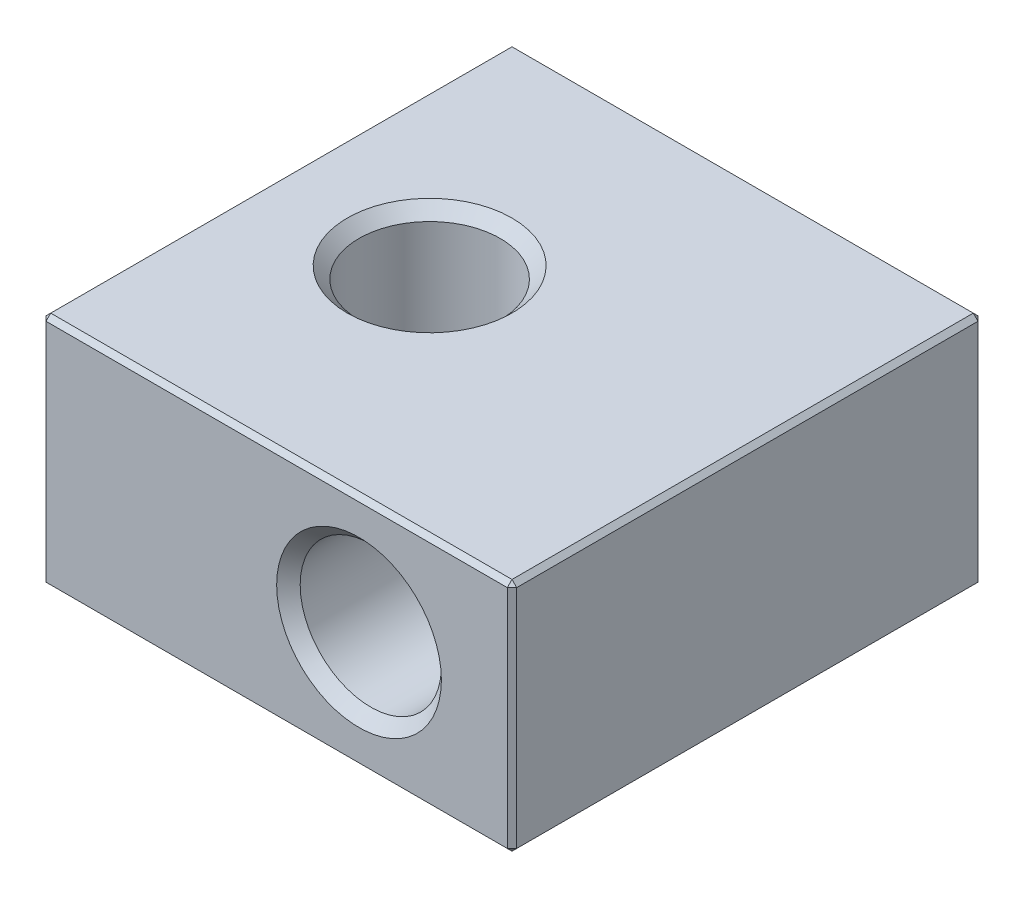
ISO-10303-21;
HEADER;
FILE_DESCRIPTION(('STEP AP214'),'2;1');
FILE_NAME('part.step','',(''),(''),'','','');
FILE_SCHEMA(('AUTOMOTIVE_DESIGN { 1 0 10303 214 1 1 1 1 }'));
ENDSEC;
DATA;
#1=APPLICATION_CONTEXT('core data for automotive mechanical design processes');
#2=APPLICATION_PROTOCOL_DEFINITION('international standard','automotive_design',2000,#1);
#3=PRODUCT_CONTEXT('',#1,'mechanical');
#4=PRODUCT('Part','Part','',(#3));
#5=PRODUCT_RELATED_PRODUCT_CATEGORY('part','',(#4));
#6=PRODUCT_DEFINITION_FORMATION('','',#4);
#7=PRODUCT_DEFINITION_CONTEXT('part definition',#1,'design');
#8=PRODUCT_DEFINITION('design','',#6,#7);
#9=PRODUCT_DEFINITION_SHAPE('','',#8);
#10=(LENGTH_UNIT() NAMED_UNIT(*) SI_UNIT(.MILLI.,.METRE.));
#11=(NAMED_UNIT(*) PLANE_ANGLE_UNIT() SI_UNIT($,.RADIAN.));
#12=(NAMED_UNIT(*) SI_UNIT($,.STERADIAN.) SOLID_ANGLE_UNIT());
#13=UNCERTAINTY_MEASURE_WITH_UNIT(LENGTH_MEASURE(1.E-05),#10,'distance_accuracy_value','');
#14=(GEOMETRIC_REPRESENTATION_CONTEXT(3) GLOBAL_UNCERTAINTY_ASSIGNED_CONTEXT((#13)) GLOBAL_UNIT_ASSIGNED_CONTEXT((#10,
#11,#12)) REPRESENTATION_CONTEXT('',''));
#15=CARTESIAN_POINT('',(0.,0.,0.));
#16=DIRECTION('',(0.,0.,1.));
#17=DIRECTION('',(1.,0.,0.));
#18=AXIS2_PLACEMENT_3D('',#15,#16,#17);
#19=CARTESIAN_POINT('',(0.,10.,0.));
#20=DIRECTION('',(0.,1.,0.));
#21=DIRECTION('',(0.,0.,1.));
#22=AXIS2_PLACEMENT_3D('',#19,#20,#21);
#23=PLANE('',#22);
#24=DIRECTION('',(1.,0.,0.));
#25=VECTOR('',#24,1.);
#26=CARTESIAN_POINT('',(18.9320388349514,10.,12.9553398058252));
#27=LINE('',#26,#25);
#28=CARTESIAN_POINT('',(-0.867961165048559,10.,12.9553398058252));
#29=VERTEX_POINT('',#28);
#30=CARTESIAN_POINT('',(18.7320388349514,10.,12.9553398058252));
#31=VERTEX_POINT('',#30);
#32=EDGE_CURVE('E138',#29,#31,#27,.T.);
#33=ORIENTED_EDGE('',*,*,#32,.T.);
#34=DIRECTION('',(0.,0.,-1.));
#35=VECTOR('',#34,1.);
#36=CARTESIAN_POINT('',(18.7320388349514,10.,-6.84466019417476));
#37=LINE('',#36,#35);
#38=CARTESIAN_POINT('',(18.7320388349514,10.,-6.64466019417476));
#39=VERTEX_POINT('',#38);
#40=EDGE_CURVE('E182',#31,#39,#37,.T.);
#41=ORIENTED_EDGE('',*,*,#40,.T.);
#42=DIRECTION('',(-1.,0.,0.));
#43=VECTOR('',#42,1.);
#44=CARTESIAN_POINT('',(-1.06796116504856,10.,-6.64466019417476));
#45=LINE('',#44,#43);
#46=CARTESIAN_POINT('',(-0.86796116504856,10.,-6.64466019417476));
#47=VERTEX_POINT('',#46);
#48=EDGE_CURVE('E141',#39,#47,#45,.T.);
#49=ORIENTED_EDGE('',*,*,#48,.T.);
#50=DIRECTION('',(0.,0.,1.));
#51=VECTOR('',#50,1.);
#52=CARTESIAN_POINT('',(-0.867961165048559,10.,13.1553398058252));
#53=LINE('',#52,#51);
#54=EDGE_CURVE('E133',#47,#29,#53,.T.);
#55=ORIENTED_EDGE('',*,*,#54,.T.);
#56=EDGE_LOOP('',(#33,#41,#49,#55));
#57=FACE_BOUND('',#56,.T.);
#58=CARTESIAN_POINT('',(5.43203883495144,10.,3.15533980582524));
#59=DIRECTION('',(0.,1.,0.));
#60=DIRECTION('',(0.,0.,1.));
#61=AXIS2_PLACEMENT_3D('',#58,#59,#60);
#62=CIRCLE('',#61,3.50000000000001);
#63=CARTESIAN_POINT('',(5.43203883495144,10.,6.65533980582525));
#64=VERTEX_POINT('',#63);
#65=EDGE_CURVE('E345',#64,#64,#62,.F.);
#66=ORIENTED_EDGE('',*,*,#65,.T.);
#67=EDGE_LOOP('',(#66));
#68=FACE_BOUND('',#67,.T.);
#69=ADVANCED_FACE('F41',(#57,#68),#23,.T.);
#70=CARTESIAN_POINT('',(0.,0.,0.));
#71=DIRECTION('',(0.,1.,0.));
#72=DIRECTION('',(0.,0.,1.));
#73=AXIS2_PLACEMENT_3D('',#70,#71,#72);
#74=PLANE('',#73);
#75=DIRECTION('',(0.,0.,1.));
#76=VECTOR('',#75,1.);
#77=CARTESIAN_POINT('',(18.7320388349514,0.,0.));
#78=LINE('',#77,#76);
#79=CARTESIAN_POINT('',(18.7320388349514,0.,-6.64466019417476));
#80=VERTEX_POINT('',#79);
#81=CARTESIAN_POINT('',(18.7320388349514,0.,12.9553398058252));
#82=VERTEX_POINT('',#81);
#83=EDGE_CURVE('E217',#80,#82,#78,.T.);
#84=ORIENTED_EDGE('',*,*,#83,.T.);
#85=DIRECTION('',(-1.,0.,0.));
#86=VECTOR('',#85,1.);
#87=CARTESIAN_POINT('',(0.,0.,12.9553398058252));
#88=LINE('',#87,#86);
#89=CARTESIAN_POINT('',(-0.867961165048559,0.,12.9553398058252));
#90=VERTEX_POINT('',#89);
#91=EDGE_CURVE('E220',#82,#90,#88,.T.);
#92=ORIENTED_EDGE('',*,*,#91,.T.);
#93=DIRECTION('',(0.,0.,-1.));
#94=VECTOR('',#93,1.);
#95=CARTESIAN_POINT('',(-0.86796116504856,0.,0.));
#96=LINE('',#95,#94);
#97=CARTESIAN_POINT('',(-0.86796116504856,0.,-6.64466019417476));
#98=VERTEX_POINT('',#97);
#99=EDGE_CURVE('E211',#90,#98,#96,.T.);
#100=ORIENTED_EDGE('',*,*,#99,.T.);
#101=DIRECTION('',(1.,0.,0.));
#102=VECTOR('',#101,1.);
#103=CARTESIAN_POINT('',(0.,0.,-6.64466019417476));
#104=LINE('',#103,#102);
#105=EDGE_CURVE('E214',#98,#80,#104,.T.);
#106=ORIENTED_EDGE('',*,*,#105,.T.);
#107=EDGE_LOOP('',(#84,#92,#100,#106));
#108=FACE_BOUND('',#107,.T.);
#109=CARTESIAN_POINT('',(5.43203883495144,0.,3.15533980582524));
#110=DIRECTION('',(0.,1.,0.));
#111=DIRECTION('',(0.,0.,1.));
#112=AXIS2_PLACEMENT_3D('',#109,#110,#111);
#113=CIRCLE('',#112,3.5);
#114=CARTESIAN_POINT('',(5.43203883495144,0.,6.65533980582525));
#115=VERTEX_POINT('',#114);
#116=EDGE_CURVE('E176',#115,#115,#113,.T.);
#117=ORIENTED_EDGE('',*,*,#116,.T.);
#118=EDGE_LOOP('',(#117));
#119=FACE_BOUND('',#118,.T.);
#120=ADVANCED_FACE('F352',(#108,#119),#74,.F.);
#121=CARTESIAN_POINT('',(-1.06796116504856,10.,-6.84466019417476));
#122=DIRECTION('',(1.,0.,0.));
#123=DIRECTION('',(0.,0.,-1.));
#124=AXIS2_PLACEMENT_3D('',#121,#122,#123);
#125=PLANE('',#124);
#126=DIRECTION('',(0.,0.,-1.));
#127=VECTOR('',#126,1.);
#128=CARTESIAN_POINT('',(-1.06796116504856,9.8,-6.84466019417476));
#129=LINE('',#128,#127);
#130=CARTESIAN_POINT('',(-1.06796116504856,9.8,12.9553398058252));
#131=VERTEX_POINT('',#130);
#132=CARTESIAN_POINT('',(-1.06796116504856,9.8,-6.64466019417476));
#133=VERTEX_POINT('',#132);
#134=EDGE_CURVE('E66',#131,#133,#129,.T.);
#135=ORIENTED_EDGE('',*,*,#134,.T.);
#136=DIRECTION('',(0.,-1.,0.));
#137=VECTOR('',#136,1.);
#138=CARTESIAN_POINT('',(-1.06796116504856,10.,-6.64466019417476));
#139=LINE('',#138,#137);
#140=CARTESIAN_POINT('',(-1.06796116504856,0.199999999999999,-6.64466019417476));
#141=VERTEX_POINT('',#140);
#142=EDGE_CURVE('E11',#133,#141,#139,.T.);
#143=ORIENTED_EDGE('',*,*,#142,.T.);
#144=DIRECTION('',(0.,0.,1.));
#145=VECTOR('',#144,1.);
#146=CARTESIAN_POINT('',(-1.06796116504856,0.199999999999999,-6.84466019417476));
#147=LINE('',#146,#145);
#148=CARTESIAN_POINT('',(-1.06796116504856,0.199999999999999,12.9553398058252));
#149=VERTEX_POINT('',#148);
#150=EDGE_CURVE('E51',#141,#149,#147,.T.);
#151=ORIENTED_EDGE('',*,*,#150,.T.);
#152=DIRECTION('',(0.,1.,0.));
#153=VECTOR('',#152,1.);
#154=CARTESIAN_POINT('',(-1.06796116504856,10.,12.9553398058252));
#155=LINE('',#154,#153);
#156=EDGE_CURVE('E237',#149,#131,#155,.T.);
#157=ORIENTED_EDGE('',*,*,#156,.T.);
#158=EDGE_LOOP('',(#135,#143,#151,#157));
#159=FACE_BOUND('',#158,.T.);
#160=ADVANCED_FACE('F375',(#159),#125,.F.);
#161=CARTESIAN_POINT('',(-1.06796116504856,10.,13.1553398058252));
#162=DIRECTION('',(0.,0.,-1.));
#163=DIRECTION('',(-1.,0.,0.));
#164=AXIS2_PLACEMENT_3D('',#161,#162,#163);
#165=PLANE('',#164);
#166=DIRECTION('',(0.,-1.,0.));
#167=VECTOR('',#166,1.);
#168=CARTESIAN_POINT('',(-0.867961165048559,10.,13.1553398058252));
#169=LINE('',#168,#167);
#170=CARTESIAN_POINT('',(-0.867961165048559,9.8,13.1553398058252));
#171=VERTEX_POINT('',#170);
#172=CARTESIAN_POINT('',(-0.867961165048559,0.199999999999999,13.1553398058252));
#173=VERTEX_POINT('',#172);
#174=EDGE_CURVE('E198',#171,#173,#169,.T.);
#175=ORIENTED_EDGE('',*,*,#174,.T.);
#176=DIRECTION('',(1.,0.,0.));
#177=VECTOR('',#176,1.);
#178=CARTESIAN_POINT('',(-1.06796116504856,0.199999999999999,13.1553398058252));
#179=LINE('',#178,#177);
#180=CARTESIAN_POINT('',(18.7320388349514,0.199999999999999,13.1553398058252));
#181=VERTEX_POINT('',#180);
#182=EDGE_CURVE('E207',#173,#181,#179,.T.);
#183=ORIENTED_EDGE('',*,*,#182,.T.);
#184=DIRECTION('',(0.,1.,0.));
#185=VECTOR('',#184,1.);
#186=CARTESIAN_POINT('',(18.7320388349514,10.,13.1553398058252));
#187=LINE('',#186,#185);
#188=CARTESIAN_POINT('',(18.7320388349514,9.8,13.1553398058252));
#189=VERTEX_POINT('',#188);
#190=EDGE_CURVE('E204',#181,#189,#187,.T.);
#191=ORIENTED_EDGE('',*,*,#190,.T.);
#192=DIRECTION('',(-1.,0.,0.));
#193=VECTOR('',#192,1.);
#194=CARTESIAN_POINT('',(-1.06796116504856,9.8,13.1553398058252));
#195=LINE('',#194,#193);
#196=EDGE_CURVE('E201',#189,#171,#195,.T.);
#197=ORIENTED_EDGE('',*,*,#196,.T.);
#198=EDGE_LOOP('',(#175,#183,#191,#197));
#199=FACE_BOUND('',#198,.T.);
#200=CARTESIAN_POINT('',(12.4320388349514,5.,13.1553398058252));
#201=DIRECTION('',(0.,0.,-1.));
#202=DIRECTION('',(-1.,0.,0.));
#203=AXIS2_PLACEMENT_3D('',#200,#201,#202);
#204=CIRCLE('',#203,3.5);
#205=CARTESIAN_POINT('',(8.93203883495145,5.,13.1553398058252));
#206=VERTEX_POINT('',#205);
#207=EDGE_CURVE('E172',#206,#206,#204,.T.);
#208=ORIENTED_EDGE('',*,*,#207,.T.);
#209=EDGE_LOOP('',(#208));
#210=FACE_BOUND('',#209,.T.);
#211=ADVANCED_FACE('F389',(#199,#210),#165,.F.);
#212=CARTESIAN_POINT('',(18.9320388349514,10.,-6.84466019417476));
#213=DIRECTION('',(-1.,0.,0.));
#214=DIRECTION('',(0.,0.,1.));
#215=AXIS2_PLACEMENT_3D('',#212,#213,#214);
#216=PLANE('',#215);
#217=DIRECTION('',(0.,1.,0.));
#218=VECTOR('',#217,1.);
#219=CARTESIAN_POINT('',(18.9320388349514,10.,-6.64466019417476));
#220=LINE('',#219,#218);
#221=CARTESIAN_POINT('',(18.9320388349514,0.199999999999999,-6.64466019417476));
#222=VERTEX_POINT('',#221);
#223=CARTESIAN_POINT('',(18.9320388349514,9.8,-6.64466019417476));
#224=VERTEX_POINT('',#223);
#225=EDGE_CURVE('E185',#222,#224,#220,.T.);
#226=ORIENTED_EDGE('',*,*,#225,.T.);
#227=DIRECTION('',(0.,0.,1.));
#228=VECTOR('',#227,1.);
#229=CARTESIAN_POINT('',(18.9320388349514,9.8,13.1553398058252));
#230=LINE('',#229,#228);
#231=CARTESIAN_POINT('',(18.9320388349514,9.8,12.9553398058252));
#232=VERTEX_POINT('',#231);
#233=EDGE_CURVE('E194',#224,#232,#230,.T.);
#234=ORIENTED_EDGE('',*,*,#233,.T.);
#235=DIRECTION('',(0.,-1.,0.));
#236=VECTOR('',#235,1.);
#237=CARTESIAN_POINT('',(18.9320388349514,10.,12.9553398058252));
#238=LINE('',#237,#236);
#239=CARTESIAN_POINT('',(18.9320388349514,0.199999999999999,12.9553398058252));
#240=VERTEX_POINT('',#239);
#241=EDGE_CURVE('E191',#232,#240,#238,.T.);
#242=ORIENTED_EDGE('',*,*,#241,.T.);
#243=DIRECTION('',(0.,0.,-1.));
#244=VECTOR('',#243,1.);
#245=CARTESIAN_POINT('',(18.9320388349514,0.199999999999999,-6.84466019417476));
#246=LINE('',#245,#244);
#247=EDGE_CURVE('E188',#240,#222,#246,.T.);
#248=ORIENTED_EDGE('',*,*,#247,.T.);
#249=EDGE_LOOP('',(#226,#234,#242,#248));
#250=FACE_BOUND('',#249,.T.);
#251=ADVANCED_FACE('F385',(#250),#216,.F.);
#252=CARTESIAN_POINT('',(-1.06796116504856,10.,-6.84466019417476));
#253=DIRECTION('',(0.,0.,1.));
#254=DIRECTION('',(1.,0.,0.));
#255=AXIS2_PLACEMENT_3D('',#252,#253,#254);
#256=PLANE('',#255);
#257=DIRECTION('',(1.,0.,0.));
#258=VECTOR('',#257,1.);
#259=CARTESIAN_POINT('',(18.9320388349514,9.8,-6.84466019417476));
#260=LINE('',#259,#258);
#261=CARTESIAN_POINT('',(-0.86796116504856,9.8,-6.84466019417476));
#262=VERTEX_POINT('',#261);
#263=CARTESIAN_POINT('',(18.7320388349514,9.8,-6.84466019417476));
#264=VERTEX_POINT('',#263);
#265=EDGE_CURVE('E230',#262,#264,#260,.T.);
#266=ORIENTED_EDGE('',*,*,#265,.T.);
#267=DIRECTION('',(0.,-1.,0.));
#268=VECTOR('',#267,1.);
#269=CARTESIAN_POINT('',(18.7320388349514,10.,-6.84466019417476));
#270=LINE('',#269,#268);
#271=CARTESIAN_POINT('',(18.7320388349514,0.199999999999999,-6.84466019417476));
#272=VERTEX_POINT('',#271);
#273=EDGE_CURVE('E233',#264,#272,#270,.T.);
#274=ORIENTED_EDGE('',*,*,#273,.T.);
#275=DIRECTION('',(-1.,0.,0.));
#276=VECTOR('',#275,1.);
#277=CARTESIAN_POINT('',(-1.06796116504856,0.199999999999999,-6.84466019417476));
#278=LINE('',#277,#276);
#279=CARTESIAN_POINT('',(-0.86796116504856,0.199999999999999,-6.84466019417476));
#280=VERTEX_POINT('',#279);
#281=EDGE_CURVE('E224',#272,#280,#278,.T.);
#282=ORIENTED_EDGE('',*,*,#281,.T.);
#283=DIRECTION('',(0.,1.,0.));
#284=VECTOR('',#283,1.);
#285=CARTESIAN_POINT('',(-0.86796116504856,10.,-6.84466019417476));
#286=LINE('',#285,#284);
#287=EDGE_CURVE('E227',#280,#262,#286,.T.);
#288=ORIENTED_EDGE('',*,*,#287,.T.);
#289=EDGE_LOOP('',(#266,#274,#282,#288));
#290=FACE_BOUND('',#289,.T.);
#291=CARTESIAN_POINT('',(12.4320388349514,5.,-6.84466019417476));
#292=DIRECTION('',(0.,0.,1.));
#293=DIRECTION('',(1.,0.,0.));
#294=AXIS2_PLACEMENT_3D('',#291,#292,#293);
#295=CIRCLE('',#294,3.5);
#296=CARTESIAN_POINT('',(15.9320388349514,5.,-6.84466019417476));
#297=VERTEX_POINT('',#296);
#298=EDGE_CURVE('E331',#297,#297,#295,.T.);
#299=ORIENTED_EDGE('',*,*,#298,.T.);
#300=EDGE_LOOP('',(#299));
#301=FACE_BOUND('',#300,.T.);
#302=ADVANCED_FACE('F382',(#290,#301),#256,.F.);
#303=CARTESIAN_POINT('',(5.43203883495144,10.,3.15533980582524));
#304=DIRECTION('',(0.,-1.,0.));
#305=DIRECTION('',(0.,0.,-1.));
#306=AXIS2_PLACEMENT_3D('',#303,#304,#305);
#307=CYLINDRICAL_SURFACE('',#306,3.);
#308=CARTESIAN_POINT('',(5.43203883495144,9.5,3.15533980582524));
#309=DIRECTION('',(0.,1.,0.));
#310=DIRECTION('',(0.,0.,1.));
#311=AXIS2_PLACEMENT_3D('',#308,#309,#310);
#312=CIRCLE('',#311,3.);
#313=CARTESIAN_POINT('',(5.43203883495144,9.5,6.15533980582524));
#314=VERTEX_POINT('',#313);
#315=EDGE_CURVE('E341',#314,#314,#312,.T.);
#316=ORIENTED_EDGE('',*,*,#315,.T.);
#317=EDGE_LOOP('',(#316));
#318=FACE_BOUND('',#317,.T.);
#319=CARTESIAN_POINT('',(5.43203883495144,0.500000000000006,3.15533980582524));
#320=DIRECTION('',(0.,1.,0.));
#321=DIRECTION('',(0.,0.,1.));
#322=AXIS2_PLACEMENT_3D('',#319,#320,#321);
#323=CIRCLE('',#322,3.);
#324=CARTESIAN_POINT('',(5.43203883495144,0.500000000000006,6.15533980582524));
#325=VERTEX_POINT('',#324);
#326=EDGE_CURVE('E337',#325,#325,#323,.F.);
#327=ORIENTED_EDGE('',*,*,#326,.T.);
#328=EDGE_LOOP('',(#327));
#329=FACE_BOUND('',#328,.T.);
#330=ADVANCED_FACE('F379',(#318,#329),#307,.F.);
#331=CARTESIAN_POINT('',(12.4320388349514,5.,13.1553398058252));
#332=DIRECTION('',(0.,0.,-1.));
#333=DIRECTION('',(-1.,0.,0.));
#334=AXIS2_PLACEMENT_3D('',#331,#332,#333);
#335=CYLINDRICAL_SURFACE('',#334,3.);
#336=CARTESIAN_POINT('',(12.4320388349514,5.,-6.34466019417476));
#337=DIRECTION('',(0.,0.,1.));
#338=DIRECTION('',(1.,0.,0.));
#339=AXIS2_PLACEMENT_3D('',#336,#337,#338);
#340=CIRCLE('',#339,3.);
#341=CARTESIAN_POINT('',(15.4320388349514,5.,-6.34466019417476));
#342=VERTEX_POINT('',#341);
#343=EDGE_CURVE('E325',#342,#342,#340,.F.);
#344=ORIENTED_EDGE('',*,*,#343,.T.);
#345=EDGE_LOOP('',(#344));
#346=FACE_BOUND('',#345,.T.);
#347=CARTESIAN_POINT('',(12.4320388349514,5.,12.6553398058252));
#348=DIRECTION('',(0.,0.,-1.));
#349=DIRECTION('',(-1.,0.,0.));
#350=AXIS2_PLACEMENT_3D('',#347,#348,#349);
#351=CIRCLE('',#350,3.);
#352=CARTESIAN_POINT('',(9.43203883495144,5.,12.6553398058252));
#353=VERTEX_POINT('',#352);
#354=EDGE_CURVE('E317',#353,#353,#351,.F.);
#355=ORIENTED_EDGE('',*,*,#354,.T.);
#356=EDGE_LOOP('',(#355));
#357=FACE_BOUND('',#356,.T.);
#358=ADVANCED_FACE('F397',(#346,#357),#335,.F.);
#359=CARTESIAN_POINT('',(12.4320388349514,5.,-6.34466019417476));
#360=DIRECTION('',(0.,0.,-1.));
#361=DIRECTION('',(-1.,0.,0.));
#362=AXIS2_PLACEMENT_3D('',#359,#360,#361);
#363=CONICAL_SURFACE('',#362,3.,0.785398163397448);
#364=ORIENTED_EDGE('',*,*,#298,.F.);
#365=EDGE_LOOP('',(#364));
#366=FACE_BOUND('',#365,.T.);
#367=ORIENTED_EDGE('',*,*,#343,.F.);
#368=EDGE_LOOP('',(#367));
#369=FACE_BOUND('',#368,.T.);
#370=ADVANCED_FACE('F366',(#366,#369),#363,.F.);
#371=CARTESIAN_POINT('',(5.43203883495144,9.5,3.15533980582524));
#372=DIRECTION('',(0.,1.,0.));
#373=DIRECTION('',(0.,0.,1.));
#374=AXIS2_PLACEMENT_3D('',#371,#372,#373);
#375=CONICAL_SURFACE('',#374,3.,0.785398163397451);
#376=ORIENTED_EDGE('',*,*,#65,.F.);
#377=EDGE_LOOP('',(#376));
#378=FACE_BOUND('',#377,.T.);
#379=ORIENTED_EDGE('',*,*,#315,.F.);
#380=EDGE_LOOP('',(#379));
#381=FACE_BOUND('',#380,.T.);
#382=ADVANCED_FACE('F357',(#378,#381),#375,.F.);
#383=CARTESIAN_POINT('',(5.43203883495144,0.,3.15533980582524));
#384=DIRECTION('',(0.,-1.,0.));
#385=DIRECTION('',(0.,0.,-1.));
#386=AXIS2_PLACEMENT_3D('',#383,#384,#385);
#387=CONICAL_SURFACE('',#386,3.5,0.785398163397445);
#388=ORIENTED_EDGE('',*,*,#326,.F.);
#389=EDGE_LOOP('',(#388));
#390=FACE_BOUND('',#389,.T.);
#391=ORIENTED_EDGE('',*,*,#116,.F.);
#392=EDGE_LOOP('',(#391));
#393=FACE_BOUND('',#392,.T.);
#394=ADVANCED_FACE('F354',(#390,#393),#387,.F.);
#395=CARTESIAN_POINT('',(12.4320388349514,5.,13.1553398058252));
#396=DIRECTION('',(0.,0.,1.));
#397=DIRECTION('',(1.,0.,0.));
#398=AXIS2_PLACEMENT_3D('',#395,#396,#397);
#399=CONICAL_SURFACE('',#398,3.5,0.785398163397441);
#400=ORIENTED_EDGE('',*,*,#354,.F.);
#401=EDGE_LOOP('',(#400));
#402=FACE_BOUND('',#401,.T.);
#403=ORIENTED_EDGE('',*,*,#207,.F.);
#404=EDGE_LOOP('',(#403));
#405=FACE_BOUND('',#404,.T.);
#406=ADVANCED_FACE('F356',(#402,#405),#399,.F.);
#407=CARTESIAN_POINT('',(-1.06796116504856,0.199999999999999,-6.84466019417476));
#408=DIRECTION('',(0.707106781186548,0.707106781186547,0.));
#409=DIRECTION('',(0.,0.,1.));
#410=AXIS2_PLACEMENT_3D('',#407,#408,#409);
#411=PLANE('',#410);
#412=DIRECTION('',(-0.707106781186547,0.707106781186548,0.));
#413=VECTOR('',#412,1.);
#414=CARTESIAN_POINT('',(-0.867961165048559,0.,12.9553398058252));
#415=LINE('',#414,#413);
#416=EDGE_CURVE('E45',#149,#90,#415,.F.);
#417=ORIENTED_EDGE('',*,*,#416,.F.);
#418=ORIENTED_EDGE('',*,*,#150,.F.);
#419=DIRECTION('',(0.707106781186547,-0.707106781186548,0.));
#420=VECTOR('',#419,1.);
#421=CARTESIAN_POINT('',(-1.06796116504856,0.199999999999999,-6.64466019417476));
#422=LINE('',#421,#420);
#423=EDGE_CURVE('E309',#98,#141,#422,.F.);
#424=ORIENTED_EDGE('',*,*,#423,.F.);
#425=ORIENTED_EDGE('',*,*,#99,.F.);
#426=EDGE_LOOP('',(#417,#418,#424,#425));
#427=FACE_BOUND('',#426,.T.);
#428=ADVANCED_FACE('F43',(#427),#411,.F.);
#429=CARTESIAN_POINT('',(-0.867961165048559,0.,12.9553398058252));
#430=DIRECTION('',(-0.577350269189626,-0.577350269189626,0.577350269189626));
#431=DIRECTION('',(0.707106781186547,0.,0.707106781186548));
#432=AXIS2_PLACEMENT_3D('',#429,#430,#431);
#433=PLANE('',#432);
#434=DIRECTION('',(0.707106781186548,0.,0.707106781186548));
#435=VECTOR('',#434,1.);
#436=CARTESIAN_POINT('',(-0.967961165048558,0.199999999999999,13.0553398058252));
#437=LINE('',#436,#435);
#438=EDGE_CURVE('E303',#149,#173,#437,.T.);
#439=ORIENTED_EDGE('',*,*,#438,.F.);
#440=ORIENTED_EDGE('',*,*,#416,.T.);
#441=DIRECTION('',(0.,-0.707106781186548,-0.707106781186548));
#442=VECTOR('',#441,1.);
#443=CARTESIAN_POINT('',(-0.867961165048559,0.,12.9553398058252));
#444=LINE('',#443,#442);
#445=EDGE_CURVE('E307',#173,#90,#444,.T.);
#446=ORIENTED_EDGE('',*,*,#445,.F.);
#447=EDGE_LOOP('',(#439,#440,#446));
#448=FACE_BOUND('',#447,.T.);
#449=ADVANCED_FACE('F483',(#448),#433,.T.);
#450=CARTESIAN_POINT('',(-1.06796116504856,0.199999999999999,-6.64466019417476));
#451=DIRECTION('',(-0.577350269189626,-0.577350269189626,-0.577350269189626));
#452=DIRECTION('',(-0.707106781186548,0.,0.707106781186548));
#453=AXIS2_PLACEMENT_3D('',#450,#451,#452);
#454=PLANE('',#453);
#455=DIRECTION('',(0.,0.707106781186548,-0.707106781186548));
#456=VECTOR('',#455,1.);
#457=CARTESIAN_POINT('',(-0.86796116504856,0.0999999999999993,-6.74466019417476));
#458=LINE('',#457,#456);
#459=EDGE_CURVE('E297',#98,#280,#458,.T.);
#460=ORIENTED_EDGE('',*,*,#459,.F.);
#461=ORIENTED_EDGE('',*,*,#423,.T.);
#462=DIRECTION('',(-0.707106781186548,0.,0.707106781186548));
#463=VECTOR('',#462,1.);
#464=CARTESIAN_POINT('',(-1.06796116504856,0.199999999999999,-6.64466019417476));
#465=LINE('',#464,#463);
#466=EDGE_CURVE('E59',#280,#141,#465,.T.);
#467=ORIENTED_EDGE('',*,*,#466,.F.);
#468=EDGE_LOOP('',(#460,#461,#467));
#469=FACE_BOUND('',#468,.T.);
#470=ADVANCED_FACE('F489',(#469),#454,.T.);
#471=CARTESIAN_POINT('',(-1.06796116504856,0.199999999999999,13.1553398058252));
#472=DIRECTION('',(0.,0.707106781186548,-0.707106781186548));
#473=DIRECTION('',(1.,0.,0.));
#474=AXIS2_PLACEMENT_3D('',#471,#472,#473);
#475=PLANE('',#474);
#476=ORIENTED_EDGE('',*,*,#445,.T.);
#477=ORIENTED_EDGE('',*,*,#91,.F.);
#478=DIRECTION('',(0.,0.707106781186547,0.707106781186547));
#479=VECTOR('',#478,1.);
#480=CARTESIAN_POINT('',(18.7320388349514,0.199999999999999,13.1553398058252));
#481=LINE('',#480,#479);
#482=EDGE_CURVE('E289',#181,#82,#481,.F.);
#483=ORIENTED_EDGE('',*,*,#482,.F.);
#484=ORIENTED_EDGE('',*,*,#182,.F.);
#485=EDGE_LOOP('',(#476,#477,#483,#484));
#486=FACE_BOUND('',#485,.T.);
#487=ADVANCED_FACE('F495',(#486),#475,.F.);
#488=CARTESIAN_POINT('',(-0.867961165048559,10.,13.1553398058252));
#489=DIRECTION('',(0.707106781186548,0.,-0.707106781186548));
#490=DIRECTION('',(0.,-1.,0.));
#491=AXIS2_PLACEMENT_3D('',#488,#489,#490);
#492=PLANE('',#491);
#493=ORIENTED_EDGE('',*,*,#438,.T.);
#494=ORIENTED_EDGE('',*,*,#174,.F.);
#495=DIRECTION('',(-0.707106781186547,0.,-0.707106781186547));
#496=VECTOR('',#495,1.);
#497=CARTESIAN_POINT('',(-0.967961165048558,9.8,13.0553398058252));
#498=LINE('',#497,#496);
#499=EDGE_CURVE('E155',#131,#171,#498,.F.);
#500=ORIENTED_EDGE('',*,*,#499,.F.);
#501=ORIENTED_EDGE('',*,*,#156,.F.);
#502=EDGE_LOOP('',(#493,#494,#500,#501));
#503=FACE_BOUND('',#502,.T.);
#504=ADVANCED_FACE('F502',(#503),#492,.F.);
#505=CARTESIAN_POINT('',(-0.86796116504856,10.,0.));
#506=DIRECTION('',(-0.707106781186548,0.707106781186547,0.));
#507=DIRECTION('',(0.,0.,-1.));
#508=AXIS2_PLACEMENT_3D('',#505,#506,#507);
#509=PLANE('',#508);
#510=DIRECTION('',(0.707106781186547,0.707106781186548,0.));
#511=VECTOR('',#510,1.);
#512=CARTESIAN_POINT('',(-0.86796116504856,10.,-6.64466019417476));
#513=LINE('',#512,#511);
#514=EDGE_CURVE('E156',#133,#47,#513,.T.);
#515=ORIENTED_EDGE('',*,*,#514,.F.);
#516=ORIENTED_EDGE('',*,*,#134,.F.);
#517=DIRECTION('',(-0.707106781186547,-0.707106781186548,0.));
#518=VECTOR('',#517,1.);
#519=CARTESIAN_POINT('',(-0.867961165048559,10.,12.9553398058252));
#520=LINE('',#519,#518);
#521=EDGE_CURVE('E148',#29,#131,#520,.T.);
#522=ORIENTED_EDGE('',*,*,#521,.F.);
#523=ORIENTED_EDGE('',*,*,#54,.F.);
#524=EDGE_LOOP('',(#515,#516,#522,#523));
#525=FACE_BOUND('',#524,.T.);
#526=ADVANCED_FACE('F150',(#525),#509,.T.);
#527=CARTESIAN_POINT('',(-1.06796116504856,10.,-6.64466019417476));
#528=DIRECTION('',(0.707106781186548,0.,0.707106781186548));
#529=DIRECTION('',(0.,-1.,0.));
#530=AXIS2_PLACEMENT_3D('',#527,#528,#529);
#531=PLANE('',#530);
#532=ORIENTED_EDGE('',*,*,#466,.T.);
#533=ORIENTED_EDGE('',*,*,#142,.F.);
#534=DIRECTION('',(0.707106781186547,0.,-0.707106781186547));
#535=VECTOR('',#534,1.);
#536=CARTESIAN_POINT('',(-0.96796116504856,9.8,-6.74466019417476));
#537=LINE('',#536,#535);
#538=EDGE_CURVE('E281',#262,#133,#537,.F.);
#539=ORIENTED_EDGE('',*,*,#538,.F.);
#540=ORIENTED_EDGE('',*,*,#287,.F.);
#541=EDGE_LOOP('',(#532,#533,#539,#540));
#542=FACE_BOUND('',#541,.T.);
#543=ADVANCED_FACE('F517',(#542),#531,.F.);
#544=CARTESIAN_POINT('',(-1.06796116504856,0.199999999999999,-6.84466019417476));
#545=DIRECTION('',(0.,0.707106781186548,0.707106781186548));
#546=DIRECTION('',(-1.,0.,0.));
#547=AXIS2_PLACEMENT_3D('',#544,#545,#546);
#548=PLANE('',#547);
#549=ORIENTED_EDGE('',*,*,#459,.T.);
#550=ORIENTED_EDGE('',*,*,#281,.F.);
#551=DIRECTION('',(0.,-0.707106781186548,0.707106781186548));
#552=VECTOR('',#551,1.);
#553=CARTESIAN_POINT('',(18.7320388349514,0.100000000000001,-6.74466019417476));
#554=LINE('',#553,#552);
#555=EDGE_CURVE('E277',#80,#272,#554,.F.);
#556=ORIENTED_EDGE('',*,*,#555,.F.);
#557=ORIENTED_EDGE('',*,*,#105,.F.);
#558=EDGE_LOOP('',(#549,#550,#556,#557));
#559=FACE_BOUND('',#558,.T.);
#560=ADVANCED_FACE('F524',(#559),#548,.F.);
#561=CARTESIAN_POINT('',(18.9320388349514,0.199999999999999,-6.84466019417476));
#562=DIRECTION('',(-0.707106781186548,0.707106781186548,0.));
#563=DIRECTION('',(0.,0.,-1.));
#564=AXIS2_PLACEMENT_3D('',#561,#562,#563);
#565=PLANE('',#564);
#566=DIRECTION('',(-0.707106781186547,-0.707106781186547,0.));
#567=VECTOR('',#566,1.);
#568=CARTESIAN_POINT('',(18.8320388349514,0.0999999999999994,12.9553398058252));
#569=LINE('',#568,#567);
#570=EDGE_CURVE('E293',#82,#240,#569,.F.);
#571=ORIENTED_EDGE('',*,*,#570,.F.);
#572=ORIENTED_EDGE('',*,*,#83,.F.);
#573=DIRECTION('',(0.707106781186548,0.707106781186548,0.));
#574=VECTOR('',#573,1.);
#575=CARTESIAN_POINT('',(18.9320388349514,0.199999999999999,-6.64466019417476));
#576=LINE('',#575,#574);
#577=EDGE_CURVE('E273',#222,#80,#576,.F.);
#578=ORIENTED_EDGE('',*,*,#577,.F.);
#579=ORIENTED_EDGE('',*,*,#247,.F.);
#580=EDGE_LOOP('',(#571,#572,#578,#579));
#581=FACE_BOUND('',#580,.T.);
#582=ADVANCED_FACE('F531',(#581),#565,.F.);
#583=CARTESIAN_POINT('',(18.7320388349514,0.199999999999999,13.1553398058252));
#584=DIRECTION('',(0.577350269189626,-0.577350269189626,0.577350269189626));
#585=DIRECTION('',(0.707106781186548,0.,-0.707106781186548));
#586=AXIS2_PLACEMENT_3D('',#583,#584,#585);
#587=PLANE('',#586);
#588=ORIENTED_EDGE('',*,*,#482,.T.);
#589=ORIENTED_EDGE('',*,*,#570,.T.);
#590=DIRECTION('',(0.707106781186547,0.,-0.707106781186547));
#591=VECTOR('',#590,1.);
#592=CARTESIAN_POINT('',(18.7320388349514,0.199999999999999,13.1553398058252));
#593=LINE('',#592,#591);
#594=EDGE_CURVE('E164',#181,#240,#593,.T.);
#595=ORIENTED_EDGE('',*,*,#594,.F.);
#596=EDGE_LOOP('',(#588,#589,#595));
#597=FACE_BOUND('',#596,.T.);
#598=ADVANCED_FACE('F539',(#597),#587,.T.);
#599=CARTESIAN_POINT('',(-0.867961165048559,10.,12.9553398058252));
#600=DIRECTION('',(-0.577350269189626,0.577350269189626,0.577350269189626));
#601=DIRECTION('',(0.707106781186548,0.,0.707106781186548));
#602=AXIS2_PLACEMENT_3D('',#599,#600,#601);
#603=PLANE('',#602);
#604=ORIENTED_EDGE('',*,*,#521,.T.);
#605=ORIENTED_EDGE('',*,*,#499,.T.);
#606=DIRECTION('',(0.,0.707106781186547,-0.707106781186547));
#607=VECTOR('',#606,1.);
#608=CARTESIAN_POINT('',(-0.867961165048559,10.,12.9553398058252));
#609=LINE('',#608,#607);
#610=EDGE_CURVE('E159',#29,#171,#609,.F.);
#611=ORIENTED_EDGE('',*,*,#610,.F.);
#612=EDGE_LOOP('',(#604,#605,#611));
#613=FACE_BOUND('',#612,.T.);
#614=ADVANCED_FACE('F160',(#613),#603,.T.);
#615=CARTESIAN_POINT('',(-0.86796116504856,10.,-6.64466019417476));
#616=DIRECTION('',(-0.577350269189626,0.577350269189626,-0.577350269189626));
#617=DIRECTION('',(-0.707106781186548,0.,0.707106781186548));
#618=AXIS2_PLACEMENT_3D('',#615,#616,#617);
#619=PLANE('',#618);
#620=ORIENTED_EDGE('',*,*,#538,.T.);
#621=ORIENTED_EDGE('',*,*,#514,.T.);
#622=DIRECTION('',(0.,-0.707106781186547,-0.707106781186547));
#623=VECTOR('',#622,1.);
#624=CARTESIAN_POINT('',(-0.86796116504856,10.,-6.64466019417476));
#625=LINE('',#624,#623);
#626=EDGE_CURVE('E165',#262,#47,#625,.F.);
#627=ORIENTED_EDGE('',*,*,#626,.F.);
#628=EDGE_LOOP('',(#620,#621,#627));
#629=FACE_BOUND('',#628,.T.);
#630=ADVANCED_FACE('F554',(#629),#619,.T.);
#631=CARTESIAN_POINT('',(18.9320388349514,0.199999999999999,-6.64466019417476));
#632=DIRECTION('',(0.577350269189629,-0.577350269189629,-0.577350269189619));
#633=DIRECTION('',(0.707106781186548,0.707106781186548,0.));
#634=AXIS2_PLACEMENT_3D('',#631,#632,#633);
#635=PLANE('',#634);
#636=ORIENTED_EDGE('',*,*,#577,.T.);
#637=ORIENTED_EDGE('',*,*,#555,.T.);
#638=DIRECTION('',(-0.707106781186541,0.,-0.707106781186554));
#639=VECTOR('',#638,1.);
#640=CARTESIAN_POINT('',(18.9320388349514,0.199999999999999,-6.64466019417476));
#641=LINE('',#640,#639);
#642=EDGE_CURVE('E264',#222,#272,#641,.T.);
#643=ORIENTED_EDGE('',*,*,#642,.F.);
#644=EDGE_LOOP('',(#636,#637,#643));
#645=FACE_BOUND('',#644,.T.);
#646=ADVANCED_FACE('F561',(#645),#635,.T.);
#647=CARTESIAN_POINT('',(18.9320388349514,10.,12.9553398058252));
#648=DIRECTION('',(-0.707106781186548,0.,-0.707106781186548));
#649=DIRECTION('',(0.,-1.,0.));
#650=AXIS2_PLACEMENT_3D('',#647,#648,#649);
#651=PLANE('',#650);
#652=ORIENTED_EDGE('',*,*,#594,.T.);
#653=ORIENTED_EDGE('',*,*,#241,.F.);
#654=DIRECTION('',(-0.707106781186547,0.,0.707106781186547));
#655=VECTOR('',#654,1.);
#656=CARTESIAN_POINT('',(18.9320388349514,9.8,12.9553398058252));
#657=LINE('',#656,#655);
#658=EDGE_CURVE('E260',#189,#232,#657,.F.);
#659=ORIENTED_EDGE('',*,*,#658,.F.);
#660=ORIENTED_EDGE('',*,*,#190,.F.);
#661=EDGE_LOOP('',(#652,#653,#659,#660));
#662=FACE_BOUND('',#661,.T.);
#663=ADVANCED_FACE('F569',(#662),#651,.F.);
#664=CARTESIAN_POINT('',(0.,10.,12.9553398058252));
#665=DIRECTION('',(0.,0.707106781186548,0.707106781186548));
#666=DIRECTION('',(-1.,0.,0.));
#667=AXIS2_PLACEMENT_3D('',#664,#665,#666);
#668=PLANE('',#667);
#669=ORIENTED_EDGE('',*,*,#610,.T.);
#670=ORIENTED_EDGE('',*,*,#196,.F.);
#671=DIRECTION('',(0.,-0.707106781186547,0.707106781186547));
#672=VECTOR('',#671,1.);
#673=CARTESIAN_POINT('',(18.7320388349514,9.9,13.0553398058252));
#674=LINE('',#673,#672);
#675=EDGE_CURVE('E169',#31,#189,#674,.T.);
#676=ORIENTED_EDGE('',*,*,#675,.F.);
#677=ORIENTED_EDGE('',*,*,#32,.F.);
#678=EDGE_LOOP('',(#669,#670,#676,#677));
#679=FACE_BOUND('',#678,.T.);
#680=ADVANCED_FACE('F167',(#679),#668,.T.);
#681=CARTESIAN_POINT('',(0.,10.,-6.64466019417476));
#682=DIRECTION('',(0.,0.707106781186548,-0.707106781186548));
#683=DIRECTION('',(1.,0.,0.));
#684=AXIS2_PLACEMENT_3D('',#681,#682,#683);
#685=PLANE('',#684);
#686=ORIENTED_EDGE('',*,*,#626,.T.);
#687=ORIENTED_EDGE('',*,*,#48,.F.);
#688=DIRECTION('',(0.,0.707106781186548,0.707106781186548));
#689=VECTOR('',#688,1.);
#690=CARTESIAN_POINT('',(18.7320388349514,10.,-6.64466019417476));
#691=LINE('',#690,#689);
#692=EDGE_CURVE('E254',#264,#39,#691,.T.);
#693=ORIENTED_EDGE('',*,*,#692,.F.);
#694=ORIENTED_EDGE('',*,*,#265,.F.);
#695=EDGE_LOOP('',(#686,#687,#693,#694));
#696=FACE_BOUND('',#695,.T.);
#697=ADVANCED_FACE('F584',(#696),#685,.T.);
#698=CARTESIAN_POINT('',(18.7320388349514,10.,-6.84466019417476));
#699=DIRECTION('',(-0.707106781186554,0.,0.707106781186541));
#700=DIRECTION('',(0.,-1.,0.));
#701=AXIS2_PLACEMENT_3D('',#698,#699,#700);
#702=PLANE('',#701);
#703=ORIENTED_EDGE('',*,*,#642,.T.);
#704=ORIENTED_EDGE('',*,*,#273,.F.);
#705=DIRECTION('',(0.707106781186541,0.,0.707106781186554));
#706=VECTOR('',#705,1.);
#707=CARTESIAN_POINT('',(18.8320388349514,9.8,-6.74466019417476));
#708=LINE('',#707,#706);
#709=EDGE_CURVE('E250',#224,#264,#708,.F.);
#710=ORIENTED_EDGE('',*,*,#709,.F.);
#711=ORIENTED_EDGE('',*,*,#225,.F.);
#712=EDGE_LOOP('',(#703,#704,#710,#711));
#713=FACE_BOUND('',#712,.T.);
#714=ADVANCED_FACE('F591',(#713),#702,.F.);
#715=CARTESIAN_POINT('',(18.9320388349514,9.8,12.9553398058252));
#716=DIRECTION('',(0.577350269189626,0.577350269189626,0.577350269189626));
#717=DIRECTION('',(0.707106781186548,0.,-0.707106781186548));
#718=AXIS2_PLACEMENT_3D('',#715,#716,#717);
#719=PLANE('',#718);
#720=ORIENTED_EDGE('',*,*,#675,.T.);
#721=ORIENTED_EDGE('',*,*,#658,.T.);
#722=DIRECTION('',(-0.707106781186547,0.707106781186547,0.));
#723=VECTOR('',#722,1.);
#724=CARTESIAN_POINT('',(18.9320388349514,9.8,12.9553398058252));
#725=LINE('',#724,#723);
#726=EDGE_CURVE('E247',#31,#232,#725,.F.);
#727=ORIENTED_EDGE('',*,*,#726,.F.);
#728=EDGE_LOOP('',(#720,#721,#727));
#729=FACE_BOUND('',#728,.T.);
#730=ADVANCED_FACE('F599',(#729),#719,.T.);
#731=CARTESIAN_POINT('',(18.7320388349514,10.,-6.64466019417476));
#732=DIRECTION('',(0.577350269189629,0.577350269189629,-0.577350269189619));
#733=DIRECTION('',(-0.707106781186548,0.707106781186548,0.));
#734=AXIS2_PLACEMENT_3D('',#731,#732,#733);
#735=PLANE('',#734);
#736=ORIENTED_EDGE('',*,*,#709,.T.);
#737=ORIENTED_EDGE('',*,*,#692,.T.);
#738=DIRECTION('',(0.707106781186548,-0.707106781186548,0.));
#739=VECTOR('',#738,1.);
#740=CARTESIAN_POINT('',(18.7320388349514,10.,-6.64466019417476));
#741=LINE('',#740,#739);
#742=EDGE_CURVE('E244',#224,#39,#741,.F.);
#743=ORIENTED_EDGE('',*,*,#742,.F.);
#744=EDGE_LOOP('',(#736,#737,#743));
#745=FACE_BOUND('',#744,.T.);
#746=ADVANCED_FACE('F607',(#745),#735,.T.);
#747=CARTESIAN_POINT('',(18.7320388349514,10.,0.));
#748=DIRECTION('',(0.707106781186548,0.707106781186548,0.));
#749=DIRECTION('',(0.,0.,1.));
#750=AXIS2_PLACEMENT_3D('',#747,#748,#749);
#751=PLANE('',#750);
#752=ORIENTED_EDGE('',*,*,#726,.T.);
#753=ORIENTED_EDGE('',*,*,#233,.F.);
#754=ORIENTED_EDGE('',*,*,#742,.T.);
#755=ORIENTED_EDGE('',*,*,#40,.F.);
#756=EDGE_LOOP('',(#752,#753,#754,#755));
#757=FACE_BOUND('',#756,.T.);
#758=ADVANCED_FACE('F615',(#757),#751,.T.);
#759=CLOSED_SHELL('',(#69,#120,#160,#211,#251,#302,#330,#358,#370,#382,#394,#406,#428,#449,#470,
#487,#504,#526,#543,#560,#582,#598,#614,#630,#646,#663,#680,#697,#714,#730,#746,#758));
#760=MANIFOLD_SOLID_BREP('B2',#759);
#761=ADVANCED_BREP_SHAPE_REPRESENTATION('',(#18,#760),#14);
#762=SHAPE_DEFINITION_REPRESENTATION(#9,#761);
ENDSEC;
END-ISO-10303-21;
